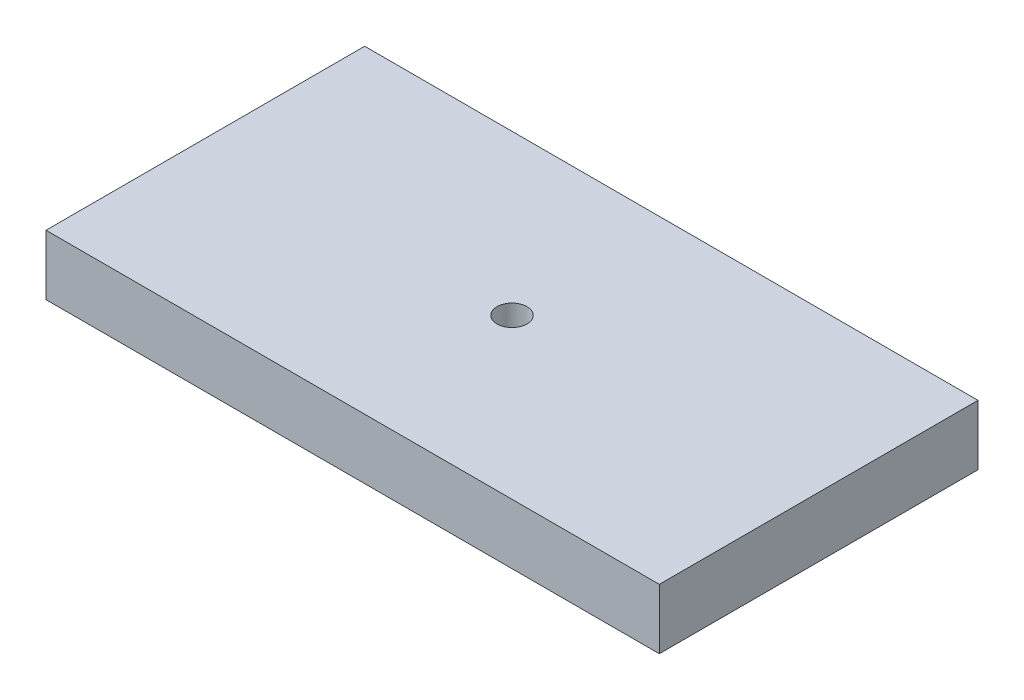
ISO-10303-21;
HEADER;
FILE_DESCRIPTION(('STEP AP214'),'2;1');
FILE_NAME('part.step','',(''),(''),'','','');
FILE_SCHEMA(('AUTOMOTIVE_DESIGN { 1 0 10303 214 1 1 1 1 }'));
ENDSEC;
DATA;
#1=APPLICATION_CONTEXT('core data for automotive mechanical design processes');
#2=APPLICATION_PROTOCOL_DEFINITION('international standard','automotive_design',2000,#1);
#3=PRODUCT_CONTEXT('',#1,'mechanical');
#4=PRODUCT('Part','Part','',(#3));
#5=PRODUCT_RELATED_PRODUCT_CATEGORY('part','',(#4));
#6=PRODUCT_DEFINITION_FORMATION('','',#4);
#7=PRODUCT_DEFINITION_CONTEXT('part definition',#1,'design');
#8=PRODUCT_DEFINITION('design','',#6,#7);
#9=PRODUCT_DEFINITION_SHAPE('','',#8);
#10=(LENGTH_UNIT() NAMED_UNIT(*) SI_UNIT(.MILLI.,.METRE.));
#11=(NAMED_UNIT(*) PLANE_ANGLE_UNIT() SI_UNIT($,.RADIAN.));
#12=(NAMED_UNIT(*) SI_UNIT($,.STERADIAN.) SOLID_ANGLE_UNIT());
#13=UNCERTAINTY_MEASURE_WITH_UNIT(LENGTH_MEASURE(1.E-05),#10,'distance_accuracy_value','');
#14=(GEOMETRIC_REPRESENTATION_CONTEXT(3) GLOBAL_UNCERTAINTY_ASSIGNED_CONTEXT((#13)) GLOBAL_UNIT_ASSIGNED_CONTEXT((#10,
#11,#12)) REPRESENTATION_CONTEXT('',''));
#15=CARTESIAN_POINT('',(0.,0.,0.));
#16=DIRECTION('',(0.,0.,1.));
#17=DIRECTION('',(1.,0.,0.));
#18=AXIS2_PLACEMENT_3D('',#15,#16,#17);
#19=CARTESIAN_POINT('',(51.,10.,-26.5));
#20=DIRECTION('',(-1.,0.,0.));
#21=DIRECTION('',(0.,0.,1.));
#22=AXIS2_PLACEMENT_3D('',#19,#20,#21);
#23=PLANE('',#22);
#24=DIRECTION('',(0.,0.,-1.));
#25=VECTOR('',#24,1.);
#26=CARTESIAN_POINT('',(51.,0.,-26.5));
#27=LINE('',#26,#25);
#28=CARTESIAN_POINT('',(51.,0.,26.5));
#29=VERTEX_POINT('',#28);
#30=CARTESIAN_POINT('',(51.,0.,-26.5));
#31=VERTEX_POINT('',#30);
#32=EDGE_CURVE('E97',#29,#31,#27,.T.);
#33=ORIENTED_EDGE('',*,*,#32,.T.);
#34=DIRECTION('',(0.,-1.,0.));
#35=VECTOR('',#34,1.);
#36=CARTESIAN_POINT('',(51.,10.,-26.5));
#37=LINE('',#36,#35);
#38=CARTESIAN_POINT('',(51.,10.,-26.5));
#39=VERTEX_POINT('',#38);
#40=EDGE_CURVE('E11',#39,#31,#37,.T.);
#41=ORIENTED_EDGE('',*,*,#40,.F.);
#42=DIRECTION('',(0.,0.,-1.));
#43=VECTOR('',#42,1.);
#44=CARTESIAN_POINT('',(51.,10.,-26.5));
#45=LINE('',#44,#43);
#46=CARTESIAN_POINT('',(51.,10.,26.5));
#47=VERTEX_POINT('',#46);
#48=EDGE_CURVE('E85',#47,#39,#45,.T.);
#49=ORIENTED_EDGE('',*,*,#48,.F.);
#50=DIRECTION('',(0.,-1.,0.));
#51=VECTOR('',#50,1.);
#52=CARTESIAN_POINT('',(51.,10.,26.5));
#53=LINE('',#52,#51);
#54=EDGE_CURVE('E93',#47,#29,#53,.T.);
#55=ORIENTED_EDGE('',*,*,#54,.T.);
#56=EDGE_LOOP('',(#33,#41,#49,#55));
#57=FACE_BOUND('',#56,.T.);
#58=ADVANCED_FACE('F34',(#57),#23,.F.);
#59=CARTESIAN_POINT('',(-51.,10.,-26.5));
#60=DIRECTION('',(0.,0.,1.));
#61=DIRECTION('',(1.,0.,0.));
#62=AXIS2_PLACEMENT_3D('',#59,#60,#61);
#63=PLANE('',#62);
#64=DIRECTION('',(-1.,0.,0.));
#65=VECTOR('',#64,1.);
#66=CARTESIAN_POINT('',(-51.,0.,-26.5));
#67=LINE('',#66,#65);
#68=CARTESIAN_POINT('',(-51.,0.,-26.5));
#69=VERTEX_POINT('',#68);
#70=EDGE_CURVE('E89',#31,#69,#67,.T.);
#71=ORIENTED_EDGE('',*,*,#70,.T.);
#72=DIRECTION('',(0.,-1.,0.));
#73=VECTOR('',#72,1.);
#74=CARTESIAN_POINT('',(-51.,10.,-26.5));
#75=LINE('',#74,#73);
#76=CARTESIAN_POINT('',(-51.,10.,-26.5));
#77=VERTEX_POINT('',#76);
#78=EDGE_CURVE('E42',#77,#69,#75,.T.);
#79=ORIENTED_EDGE('',*,*,#78,.F.);
#80=DIRECTION('',(-1.,0.,0.));
#81=VECTOR('',#80,1.);
#82=CARTESIAN_POINT('',(-51.,10.,-26.5));
#83=LINE('',#82,#81);
#84=EDGE_CURVE('E80',#39,#77,#83,.T.);
#85=ORIENTED_EDGE('',*,*,#84,.F.);
#86=ORIENTED_EDGE('',*,*,#40,.T.);
#87=EDGE_LOOP('',(#71,#79,#85,#86));
#88=FACE_BOUND('',#87,.T.);
#89=ADVANCED_FACE('F88',(#88),#63,.F.);
#90=CARTESIAN_POINT('',(-51.,10.,-26.5));
#91=DIRECTION('',(1.,0.,0.));
#92=DIRECTION('',(0.,0.,-1.));
#93=AXIS2_PLACEMENT_3D('',#90,#91,#92);
#94=PLANE('',#93);
#95=DIRECTION('',(0.,0.,1.));
#96=VECTOR('',#95,1.);
#97=CARTESIAN_POINT('',(-51.,0.,-26.5));
#98=LINE('',#97,#96);
#99=CARTESIAN_POINT('',(-51.,0.,26.5));
#100=VERTEX_POINT('',#99);
#101=EDGE_CURVE('E67',#69,#100,#98,.T.);
#102=ORIENTED_EDGE('',*,*,#101,.T.);
#103=DIRECTION('',(0.,-1.,0.));
#104=VECTOR('',#103,1.);
#105=CARTESIAN_POINT('',(-51.,10.,26.5));
#106=LINE('',#105,#104);
#107=CARTESIAN_POINT('',(-51.,10.,26.5));
#108=VERTEX_POINT('',#107);
#109=EDGE_CURVE('E90',#108,#100,#106,.T.);
#110=ORIENTED_EDGE('',*,*,#109,.F.);
#111=DIRECTION('',(0.,0.,1.));
#112=VECTOR('',#111,1.);
#113=CARTESIAN_POINT('',(-51.,10.,-26.5));
#114=LINE('',#113,#112);
#115=EDGE_CURVE('E83',#77,#108,#114,.T.);
#116=ORIENTED_EDGE('',*,*,#115,.F.);
#117=ORIENTED_EDGE('',*,*,#78,.T.);
#118=EDGE_LOOP('',(#102,#110,#116,#117));
#119=FACE_BOUND('',#118,.T.);
#120=ADVANCED_FACE('F91',(#119),#94,.F.);
#121=CARTESIAN_POINT('',(-51.,10.,26.5));
#122=DIRECTION('',(0.,0.,-1.));
#123=DIRECTION('',(-1.,0.,0.));
#124=AXIS2_PLACEMENT_3D('',#121,#122,#123);
#125=PLANE('',#124);
#126=DIRECTION('',(1.,0.,0.));
#127=VECTOR('',#126,1.);
#128=CARTESIAN_POINT('',(-51.,0.,26.5));
#129=LINE('',#128,#127);
#130=EDGE_CURVE('E73',#100,#29,#129,.T.);
#131=ORIENTED_EDGE('',*,*,#130,.T.);
#132=ORIENTED_EDGE('',*,*,#54,.F.);
#133=DIRECTION('',(1.,0.,0.));
#134=VECTOR('',#133,1.);
#135=CARTESIAN_POINT('',(-51.,10.,26.5));
#136=LINE('',#135,#134);
#137=EDGE_CURVE('E50',#108,#47,#136,.T.);
#138=ORIENTED_EDGE('',*,*,#137,.F.);
#139=ORIENTED_EDGE('',*,*,#109,.T.);
#140=EDGE_LOOP('',(#131,#132,#138,#139));
#141=FACE_BOUND('',#140,.T.);
#142=ADVANCED_FACE('F105',(#141),#125,.F.);
#143=CARTESIAN_POINT('',(0.,10.,0.));
#144=DIRECTION('',(0.,1.,0.));
#145=DIRECTION('',(0.,0.,1.));
#146=AXIS2_PLACEMENT_3D('',#143,#144,#145);
#147=PLANE('',#146);
#148=CARTESIAN_POINT('',(0.,10.,0.));
#149=DIRECTION('',(0.,1.,0.));
#150=DIRECTION('',(0.,0.,1.));
#151=AXIS2_PLACEMENT_3D('',#148,#149,#150);
#152=CIRCLE('',#151,2.5);
#153=CARTESIAN_POINT('',(0.,10.,2.5));
#154=VERTEX_POINT('',#153);
#155=EDGE_CURVE('E111',#154,#154,#152,.T.);
#156=ORIENTED_EDGE('',*,*,#155,.F.);
#157=EDGE_LOOP('',(#156));
#158=FACE_BOUND('',#157,.T.);
#159=ORIENTED_EDGE('',*,*,#48,.T.);
#160=ORIENTED_EDGE('',*,*,#84,.T.);
#161=ORIENTED_EDGE('',*,*,#115,.T.);
#162=ORIENTED_EDGE('',*,*,#137,.T.);
#163=EDGE_LOOP('',(#159,#160,#161,#162));
#164=FACE_BOUND('',#163,.T.);
#165=ADVANCED_FACE('F81',(#158,#164),#147,.T.);
#166=CARTESIAN_POINT('',(0.,0.,0.));
#167=DIRECTION('',(0.,1.,0.));
#168=DIRECTION('',(0.,0.,1.));
#169=AXIS2_PLACEMENT_3D('',#166,#167,#168);
#170=PLANE('',#169);
#171=CARTESIAN_POINT('',(0.,0.,0.));
#172=DIRECTION('',(0.,1.,0.));
#173=DIRECTION('',(0.,0.,1.));
#174=AXIS2_PLACEMENT_3D('',#171,#172,#173);
#175=CIRCLE('',#174,2.5);
#176=CARTESIAN_POINT('',(0.,0.,2.5));
#177=VERTEX_POINT('',#176);
#178=EDGE_CURVE('E100',#177,#177,#175,.T.);
#179=ORIENTED_EDGE('',*,*,#178,.T.);
#180=EDGE_LOOP('',(#179));
#181=FACE_BOUND('',#180,.T.);
#182=ORIENTED_EDGE('',*,*,#32,.F.);
#183=ORIENTED_EDGE('',*,*,#130,.F.);
#184=ORIENTED_EDGE('',*,*,#101,.F.);
#185=ORIENTED_EDGE('',*,*,#70,.F.);
#186=EDGE_LOOP('',(#182,#183,#184,#185));
#187=FACE_BOUND('',#186,.T.);
#188=ADVANCED_FACE('F108',(#181,#187),#170,.F.);
#189=CARTESIAN_POINT('',(0.,0.,0.));
#190=DIRECTION('',(0.,1.,0.));
#191=DIRECTION('',(0.,0.,1.));
#192=AXIS2_PLACEMENT_3D('',#189,#190,#191);
#193=CYLINDRICAL_SURFACE('',#192,2.5);
#194=ORIENTED_EDGE('',*,*,#178,.F.);
#195=EDGE_LOOP('',(#194));
#196=FACE_BOUND('',#195,.T.);
#197=ORIENTED_EDGE('',*,*,#155,.T.);
#198=EDGE_LOOP('',(#197));
#199=FACE_BOUND('',#198,.T.);
#200=ADVANCED_FACE('F118',(#196,#199),#193,.F.);
#201=CLOSED_SHELL('',(#58,#89,#120,#142,#165,#188,#200));
#202=MANIFOLD_SOLID_BREP('B2',#201);
#203=ADVANCED_BREP_SHAPE_REPRESENTATION('',(#18,#202),#14);
#204=SHAPE_DEFINITION_REPRESENTATION(#9,#203);
ENDSEC;
END-ISO-10303-21;
